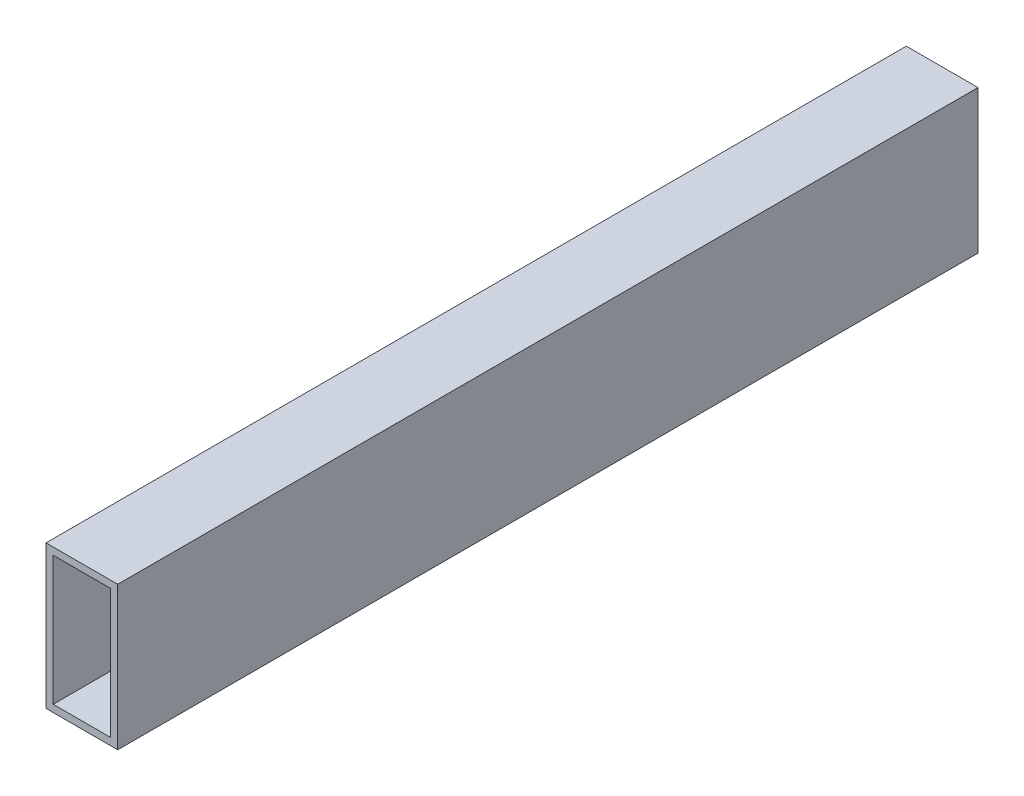
ISO-10303-21;
HEADER;
FILE_DESCRIPTION(('STEP AP214'),'2;1');
FILE_NAME('part.step','',(''),(''),'','','');
FILE_SCHEMA(('AUTOMOTIVE_DESIGN { 1 0 10303 214 1 1 1 1 }'));
ENDSEC;
DATA;
#1=APPLICATION_CONTEXT('core data for automotive mechanical design processes');
#2=APPLICATION_PROTOCOL_DEFINITION('international standard','automotive_design',2000,#1);
#3=PRODUCT_CONTEXT('',#1,'mechanical');
#4=PRODUCT('Part','Part','',(#3));
#5=PRODUCT_RELATED_PRODUCT_CATEGORY('part','',(#4));
#6=PRODUCT_DEFINITION_FORMATION('','',#4);
#7=PRODUCT_DEFINITION_CONTEXT('part definition',#1,'design');
#8=PRODUCT_DEFINITION('design','',#6,#7);
#9=PRODUCT_DEFINITION_SHAPE('','',#8);
#10=(LENGTH_UNIT() NAMED_UNIT(*) SI_UNIT(.MILLI.,.METRE.));
#11=(NAMED_UNIT(*) PLANE_ANGLE_UNIT() SI_UNIT($,.RADIAN.));
#12=(NAMED_UNIT(*) SI_UNIT($,.STERADIAN.) SOLID_ANGLE_UNIT());
#13=UNCERTAINTY_MEASURE_WITH_UNIT(LENGTH_MEASURE(1.E-05),#10,'distance_accuracy_value','');
#14=(GEOMETRIC_REPRESENTATION_CONTEXT(3) GLOBAL_UNCERTAINTY_ASSIGNED_CONTEXT((#13)) GLOBAL_UNIT_ASSIGNED_CONTEXT((#10,
#11,#12)) REPRESENTATION_CONTEXT('',''));
#15=CARTESIAN_POINT('',(0.,0.,0.));
#16=DIRECTION('',(0.,0.,1.));
#17=DIRECTION('',(1.,0.,0.));
#18=AXIS2_PLACEMENT_3D('',#15,#16,#17);
#19=CARTESIAN_POINT('',(0.,0.,300.));
#20=DIRECTION('',(0.,0.,1.));
#21=DIRECTION('',(1.,0.,0.));
#22=AXIS2_PLACEMENT_3D('',#19,#20,#21);
#23=PLANE('',#22);
#24=DIRECTION('',(0.,1.,0.));
#25=VECTOR('',#24,1.);
#26=CARTESIAN_POINT('',(12.5,25.,300.));
#27=LINE('',#26,#25);
#28=CARTESIAN_POINT('',(12.5,-25.,300.));
#29=VERTEX_POINT('',#28);
#30=CARTESIAN_POINT('',(12.5,25.,300.));
#31=VERTEX_POINT('',#30);
#32=EDGE_CURVE('E134',#29,#31,#27,.T.);
#33=ORIENTED_EDGE('',*,*,#32,.T.);
#34=DIRECTION('',(-1.,0.,0.));
#35=VECTOR('',#34,1.);
#36=CARTESIAN_POINT('',(-12.5,25.,300.));
#37=LINE('',#36,#35);
#38=CARTESIAN_POINT('',(-12.5,25.,300.));
#39=VERTEX_POINT('',#38);
#40=EDGE_CURVE('E137',#31,#39,#37,.T.);
#41=ORIENTED_EDGE('',*,*,#40,.T.);
#42=DIRECTION('',(0.,-1.,0.));
#43=VECTOR('',#42,1.);
#44=CARTESIAN_POINT('',(-12.5,25.,300.));
#45=LINE('',#44,#43);
#46=CARTESIAN_POINT('',(-12.5,-25.,300.));
#47=VERTEX_POINT('',#46);
#48=EDGE_CURVE('E140',#39,#47,#45,.T.);
#49=ORIENTED_EDGE('',*,*,#48,.T.);
#50=DIRECTION('',(1.,0.,0.));
#51=VECTOR('',#50,1.);
#52=CARTESIAN_POINT('',(-12.5,-25.,300.));
#53=LINE('',#52,#51);
#54=EDGE_CURVE('E142',#47,#29,#53,.T.);
#55=ORIENTED_EDGE('',*,*,#54,.T.);
#56=EDGE_LOOP('',(#33,#41,#49,#55));
#57=FACE_BOUND('',#56,.T.);
#58=DIRECTION('',(-1.,0.,0.));
#59=VECTOR('',#58,1.);
#60=CARTESIAN_POINT('',(-10.,22.5,300.));
#61=LINE('',#60,#59);
#62=CARTESIAN_POINT('',(10.,22.5,300.));
#63=VERTEX_POINT('',#62);
#64=CARTESIAN_POINT('',(-10.,22.5,300.));
#65=VERTEX_POINT('',#64);
#66=EDGE_CURVE('E106',#63,#65,#61,.T.);
#67=ORIENTED_EDGE('',*,*,#66,.F.);
#68=DIRECTION('',(0.,1.,0.));
#69=VECTOR('',#68,1.);
#70=CARTESIAN_POINT('',(10.,22.5,300.));
#71=LINE('',#70,#69);
#72=CARTESIAN_POINT('',(10.,-22.5,300.));
#73=VERTEX_POINT('',#72);
#74=EDGE_CURVE('E98',#73,#63,#71,.T.);
#75=ORIENTED_EDGE('',*,*,#74,.F.);
#76=DIRECTION('',(1.,0.,0.));
#77=VECTOR('',#76,1.);
#78=CARTESIAN_POINT('',(-10.,-22.5,300.));
#79=LINE('',#78,#77);
#80=CARTESIAN_POINT('',(-10.,-22.5,300.));
#81=VERTEX_POINT('',#80);
#82=EDGE_CURVE('E120',#81,#73,#79,.T.);
#83=ORIENTED_EDGE('',*,*,#82,.F.);
#84=DIRECTION('',(0.,-1.,0.));
#85=VECTOR('',#84,1.);
#86=CARTESIAN_POINT('',(-10.,22.5,300.));
#87=LINE('',#86,#85);
#88=EDGE_CURVE('E118',#65,#81,#87,.T.);
#89=ORIENTED_EDGE('',*,*,#88,.F.);
#90=EDGE_LOOP('',(#67,#75,#83,#89));
#91=FACE_BOUND('',#90,.T.);
#92=ADVANCED_FACE('F33',(#57,#91),#23,.T.);
#93=CARTESIAN_POINT('',(0.,0.,0.));
#94=DIRECTION('',(0.,0.,1.));
#95=DIRECTION('',(1.,0.,0.));
#96=AXIS2_PLACEMENT_3D('',#93,#94,#95);
#97=PLANE('',#96);
#98=DIRECTION('',(0.,1.,0.));
#99=VECTOR('',#98,1.);
#100=CARTESIAN_POINT('',(12.5,25.,0.));
#101=LINE('',#100,#99);
#102=CARTESIAN_POINT('',(12.5,-25.,0.));
#103=VERTEX_POINT('',#102);
#104=CARTESIAN_POINT('',(12.5,25.,0.));
#105=VERTEX_POINT('',#104);
#106=EDGE_CURVE('E114',#103,#105,#101,.T.);
#107=ORIENTED_EDGE('',*,*,#106,.F.);
#108=DIRECTION('',(1.,0.,0.));
#109=VECTOR('',#108,1.);
#110=CARTESIAN_POINT('',(-12.5,-25.,0.));
#111=LINE('',#110,#109);
#112=CARTESIAN_POINT('',(-12.5,-25.,0.));
#113=VERTEX_POINT('',#112);
#114=EDGE_CURVE('E138',#113,#103,#111,.T.);
#115=ORIENTED_EDGE('',*,*,#114,.F.);
#116=DIRECTION('',(0.,-1.,0.));
#117=VECTOR('',#116,1.);
#118=CARTESIAN_POINT('',(-12.5,25.,0.));
#119=LINE('',#118,#117);
#120=CARTESIAN_POINT('',(-12.5,25.,0.));
#121=VERTEX_POINT('',#120);
#122=EDGE_CURVE('E149',#121,#113,#119,.T.);
#123=ORIENTED_EDGE('',*,*,#122,.F.);
#124=DIRECTION('',(-1.,0.,0.));
#125=VECTOR('',#124,1.);
#126=CARTESIAN_POINT('',(-12.5,25.,0.));
#127=LINE('',#126,#125);
#128=EDGE_CURVE('E147',#105,#121,#127,.T.);
#129=ORIENTED_EDGE('',*,*,#128,.F.);
#130=EDGE_LOOP('',(#107,#115,#123,#129));
#131=FACE_BOUND('',#130,.T.);
#132=DIRECTION('',(0.,1.,0.));
#133=VECTOR('',#132,1.);
#134=CARTESIAN_POINT('',(10.,22.5,0.));
#135=LINE('',#134,#133);
#136=CARTESIAN_POINT('',(10.,-22.5,0.));
#137=VERTEX_POINT('',#136);
#138=CARTESIAN_POINT('',(10.,22.5,0.));
#139=VERTEX_POINT('',#138);
#140=EDGE_CURVE('E56',#137,#139,#135,.T.);
#141=ORIENTED_EDGE('',*,*,#140,.T.);
#142=DIRECTION('',(-1.,0.,0.));
#143=VECTOR('',#142,1.);
#144=CARTESIAN_POINT('',(-10.,22.5,0.));
#145=LINE('',#144,#143);
#146=CARTESIAN_POINT('',(-10.,22.5,0.));
#147=VERTEX_POINT('',#146);
#148=EDGE_CURVE('E113',#139,#147,#145,.T.);
#149=ORIENTED_EDGE('',*,*,#148,.T.);
#150=DIRECTION('',(0.,-1.,0.));
#151=VECTOR('',#150,1.);
#152=CARTESIAN_POINT('',(-10.,22.5,0.));
#153=LINE('',#152,#151);
#154=CARTESIAN_POINT('',(-10.,-22.5,0.));
#155=VERTEX_POINT('',#154);
#156=EDGE_CURVE('E126',#147,#155,#153,.T.);
#157=ORIENTED_EDGE('',*,*,#156,.T.);
#158=DIRECTION('',(1.,0.,0.));
#159=VECTOR('',#158,1.);
#160=CARTESIAN_POINT('',(-10.,-22.5,0.));
#161=LINE('',#160,#159);
#162=EDGE_CURVE('E107',#155,#137,#161,.T.);
#163=ORIENTED_EDGE('',*,*,#162,.T.);
#164=EDGE_LOOP('',(#141,#149,#157,#163));
#165=FACE_BOUND('',#164,.T.);
#166=ADVANCED_FACE('F167',(#131,#165),#97,.F.);
#167=CARTESIAN_POINT('',(12.5,25.,300.));
#168=DIRECTION('',(-1.,0.,0.));
#169=DIRECTION('',(0.,0.,1.));
#170=AXIS2_PLACEMENT_3D('',#167,#168,#169);
#171=PLANE('',#170);
#172=ORIENTED_EDGE('',*,*,#106,.T.);
#173=DIRECTION('',(0.,0.,-1.));
#174=VECTOR('',#173,1.);
#175=CARTESIAN_POINT('',(12.5,25.,300.));
#176=LINE('',#175,#174);
#177=EDGE_CURVE('E11',#31,#105,#176,.T.);
#178=ORIENTED_EDGE('',*,*,#177,.F.);
#179=ORIENTED_EDGE('',*,*,#32,.F.);
#180=DIRECTION('',(0.,0.,-1.));
#181=VECTOR('',#180,1.);
#182=CARTESIAN_POINT('',(12.5,-25.,300.));
#183=LINE('',#182,#181);
#184=EDGE_CURVE('E144',#29,#103,#183,.T.);
#185=ORIENTED_EDGE('',*,*,#184,.T.);
#186=EDGE_LOOP('',(#172,#178,#179,#185));
#187=FACE_BOUND('',#186,.T.);
#188=ADVANCED_FACE('F35',(#187),#171,.F.);
#189=CARTESIAN_POINT('',(-12.5,25.,300.));
#190=DIRECTION('',(0.,-1.,0.));
#191=DIRECTION('',(0.,0.,-1.));
#192=AXIS2_PLACEMENT_3D('',#189,#190,#191);
#193=PLANE('',#192);
#194=ORIENTED_EDGE('',*,*,#128,.T.);
#195=DIRECTION('',(0.,0.,-1.));
#196=VECTOR('',#195,1.);
#197=CARTESIAN_POINT('',(-12.5,25.,300.));
#198=LINE('',#197,#196);
#199=EDGE_CURVE('E41',#39,#121,#198,.T.);
#200=ORIENTED_EDGE('',*,*,#199,.F.);
#201=ORIENTED_EDGE('',*,*,#40,.F.);
#202=ORIENTED_EDGE('',*,*,#177,.T.);
#203=EDGE_LOOP('',(#194,#200,#201,#202));
#204=FACE_BOUND('',#203,.T.);
#205=ADVANCED_FACE('F177',(#204),#193,.F.);
#206=CARTESIAN_POINT('',(-12.5,25.,300.));
#207=DIRECTION('',(1.,0.,0.));
#208=DIRECTION('',(0.,1.,0.));
#209=AXIS2_PLACEMENT_3D('',#206,#207,#208);
#210=PLANE('',#209);
#211=ORIENTED_EDGE('',*,*,#122,.T.);
#212=DIRECTION('',(0.,0.,-1.));
#213=VECTOR('',#212,1.);
#214=CARTESIAN_POINT('',(-12.5,-25.,300.));
#215=LINE('',#214,#213);
#216=EDGE_CURVE('E154',#47,#113,#215,.T.);
#217=ORIENTED_EDGE('',*,*,#216,.F.);
#218=ORIENTED_EDGE('',*,*,#48,.F.);
#219=ORIENTED_EDGE('',*,*,#199,.T.);
#220=EDGE_LOOP('',(#211,#217,#218,#219));
#221=FACE_BOUND('',#220,.T.);
#222=ADVANCED_FACE('F161',(#221),#210,.F.);
#223=CARTESIAN_POINT('',(-12.5,-25.,300.));
#224=DIRECTION('',(0.,1.,0.));
#225=DIRECTION('',(0.,0.,1.));
#226=AXIS2_PLACEMENT_3D('',#223,#224,#225);
#227=PLANE('',#226);
#228=ORIENTED_EDGE('',*,*,#114,.T.);
#229=ORIENTED_EDGE('',*,*,#184,.F.);
#230=ORIENTED_EDGE('',*,*,#54,.F.);
#231=ORIENTED_EDGE('',*,*,#216,.T.);
#232=EDGE_LOOP('',(#228,#229,#230,#231));
#233=FACE_BOUND('',#232,.T.);
#234=ADVANCED_FACE('F171',(#233),#227,.F.);
#235=CARTESIAN_POINT('',(10.,22.5,300.));
#236=DIRECTION('',(-1.,0.,0.));
#237=DIRECTION('',(0.,0.,1.));
#238=AXIS2_PLACEMENT_3D('',#235,#236,#237);
#239=PLANE('',#238);
#240=ORIENTED_EDGE('',*,*,#140,.F.);
#241=DIRECTION('',(0.,0.,-1.));
#242=VECTOR('',#241,1.);
#243=CARTESIAN_POINT('',(10.,-22.5,300.));
#244=LINE('',#243,#242);
#245=EDGE_CURVE('E102',#73,#137,#244,.T.);
#246=ORIENTED_EDGE('',*,*,#245,.F.);
#247=ORIENTED_EDGE('',*,*,#74,.T.);
#248=DIRECTION('',(0.,0.,-1.));
#249=VECTOR('',#248,1.);
#250=CARTESIAN_POINT('',(10.,22.5,300.));
#251=LINE('',#250,#249);
#252=EDGE_CURVE('E101',#63,#139,#251,.T.);
#253=ORIENTED_EDGE('',*,*,#252,.T.);
#254=EDGE_LOOP('',(#240,#246,#247,#253));
#255=FACE_BOUND('',#254,.T.);
#256=ADVANCED_FACE('F100',(#255),#239,.T.);
#257=CARTESIAN_POINT('',(-10.,22.5,300.));
#258=DIRECTION('',(0.,-1.,0.));
#259=DIRECTION('',(0.,0.,-1.));
#260=AXIS2_PLACEMENT_3D('',#257,#258,#259);
#261=PLANE('',#260);
#262=ORIENTED_EDGE('',*,*,#148,.F.);
#263=ORIENTED_EDGE('',*,*,#252,.F.);
#264=ORIENTED_EDGE('',*,*,#66,.T.);
#265=DIRECTION('',(0.,0.,-1.));
#266=VECTOR('',#265,1.);
#267=CARTESIAN_POINT('',(-10.,22.5,300.));
#268=LINE('',#267,#266);
#269=EDGE_CURVE('E115',#65,#147,#268,.T.);
#270=ORIENTED_EDGE('',*,*,#269,.T.);
#271=EDGE_LOOP('',(#262,#263,#264,#270));
#272=FACE_BOUND('',#271,.T.);
#273=ADVANCED_FACE('F110',(#272),#261,.T.);
#274=CARTESIAN_POINT('',(-10.,22.5,300.));
#275=DIRECTION('',(1.,0.,0.));
#276=DIRECTION('',(0.,0.,-1.));
#277=AXIS2_PLACEMENT_3D('',#274,#275,#276);
#278=PLANE('',#277);
#279=ORIENTED_EDGE('',*,*,#156,.F.);
#280=ORIENTED_EDGE('',*,*,#269,.F.);
#281=ORIENTED_EDGE('',*,*,#88,.T.);
#282=DIRECTION('',(0.,0.,-1.));
#283=VECTOR('',#282,1.);
#284=CARTESIAN_POINT('',(-10.,-22.5,300.));
#285=LINE('',#284,#283);
#286=EDGE_CURVE('E48',#81,#155,#285,.T.);
#287=ORIENTED_EDGE('',*,*,#286,.T.);
#288=EDGE_LOOP('',(#279,#280,#281,#287));
#289=FACE_BOUND('',#288,.T.);
#290=ADVANCED_FACE('F200',(#289),#278,.T.);
#291=CARTESIAN_POINT('',(-10.,-22.5,300.));
#292=DIRECTION('',(0.,1.,0.));
#293=DIRECTION('',(0.,0.,1.));
#294=AXIS2_PLACEMENT_3D('',#291,#292,#293);
#295=PLANE('',#294);
#296=ORIENTED_EDGE('',*,*,#162,.F.);
#297=ORIENTED_EDGE('',*,*,#286,.F.);
#298=ORIENTED_EDGE('',*,*,#82,.T.);
#299=ORIENTED_EDGE('',*,*,#245,.T.);
#300=EDGE_LOOP('',(#296,#297,#298,#299));
#301=FACE_BOUND('',#300,.T.);
#302=ADVANCED_FACE('F204',(#301),#295,.T.);
#303=CLOSED_SHELL('',(#92,#166,#188,#205,#222,#234,#256,#273,#290,#302));
#304=MANIFOLD_SOLID_BREP('B2',#303);
#305=ADVANCED_BREP_SHAPE_REPRESENTATION('',(#18,#304),#14);
#306=SHAPE_DEFINITION_REPRESENTATION(#9,#305);
ENDSEC;
END-ISO-10303-21;
